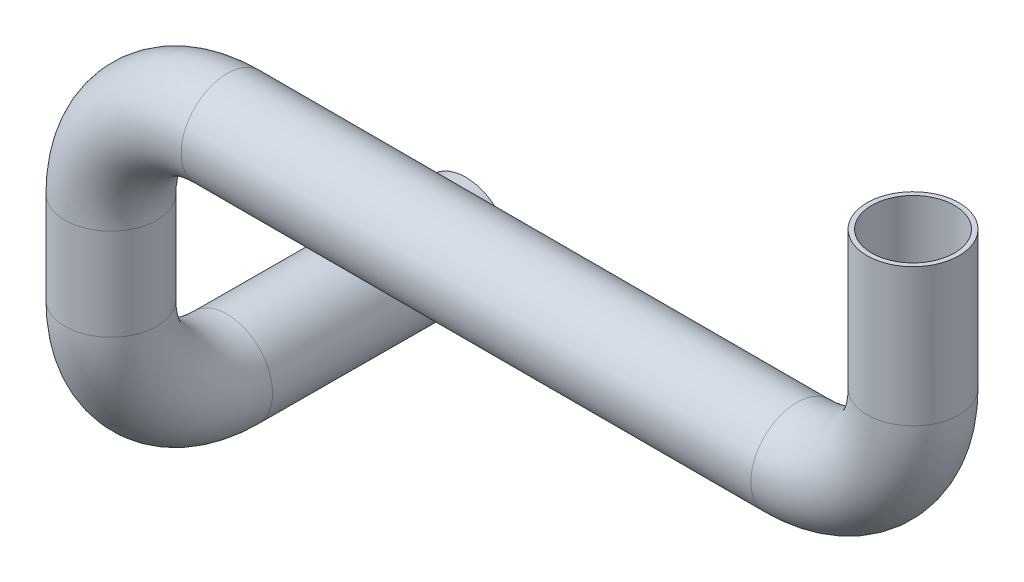
ISO-10303-21;
HEADER;
FILE_DESCRIPTION(('STEP AP214'),'2;1');
FILE_NAME('part.step','',(''),(''),'','','');
FILE_SCHEMA(('AUTOMOTIVE_DESIGN { 1 0 10303 214 1 1 1 1 }'));
ENDSEC;
DATA;
#1=APPLICATION_CONTEXT('core data for automotive mechanical design processes');
#2=APPLICATION_PROTOCOL_DEFINITION('international standard','automotive_design',2000,#1);
#3=PRODUCT_CONTEXT('',#1,'mechanical');
#4=PRODUCT('Part','Part','',(#3));
#5=PRODUCT_RELATED_PRODUCT_CATEGORY('part','',(#4));
#6=PRODUCT_DEFINITION_FORMATION('','',#4);
#7=PRODUCT_DEFINITION_CONTEXT('part definition',#1,'design');
#8=PRODUCT_DEFINITION('design','',#6,#7);
#9=PRODUCT_DEFINITION_SHAPE('','',#8);
#10=(LENGTH_UNIT() NAMED_UNIT(*) SI_UNIT(.MILLI.,.METRE.));
#11=(NAMED_UNIT(*) PLANE_ANGLE_UNIT() SI_UNIT($,.RADIAN.));
#12=(NAMED_UNIT(*) SI_UNIT($,.STERADIAN.) SOLID_ANGLE_UNIT());
#13=UNCERTAINTY_MEASURE_WITH_UNIT(LENGTH_MEASURE(1.E-05),#10,'distance_accuracy_value','');
#14=(GEOMETRIC_REPRESENTATION_CONTEXT(3) GLOBAL_UNCERTAINTY_ASSIGNED_CONTEXT((#13)) GLOBAL_UNIT_ASSIGNED_CONTEXT((#10,
#11,#12)) REPRESENTATION_CONTEXT('',''));
#15=CARTESIAN_POINT('',(0.,0.,0.));
#16=DIRECTION('',(0.,0.,1.));
#17=DIRECTION('',(1.,0.,0.));
#18=AXIS2_PLACEMENT_3D('',#15,#16,#17);
#19=CARTESIAN_POINT('',(87.3,50.3,0.));
#20=DIRECTION('',(0.,1.,0.));
#21=DIRECTION('',(0.,0.,1.));
#22=AXIS2_PLACEMENT_3D('',#19,#20,#21);
#23=PLANE('',#22);
#24=CARTESIAN_POINT('',(87.3,50.3,0.));
#25=DIRECTION('',(0.,1.,0.));
#26=DIRECTION('',(0.,0.,1.));
#27=AXIS2_PLACEMENT_3D('',#24,#25,#26);
#28=CIRCLE('',#27,4.5);
#29=CARTESIAN_POINT('',(87.3,50.3,4.5));
#30=VERTEX_POINT('',#29);
#31=EDGE_CURVE('E62',#30,#30,#28,.T.);
#32=ORIENTED_EDGE('',*,*,#31,.F.);
#33=EDGE_LOOP('',(#32));
#34=FACE_BOUND('',#33,.T.);
#35=CARTESIAN_POINT('',(87.3,50.3,0.));
#36=DIRECTION('',(0.,1.,0.));
#37=DIRECTION('',(0.,0.,1.));
#38=AXIS2_PLACEMENT_3D('',#35,#36,#37);
#39=CIRCLE('',#38,5.);
#40=CARTESIAN_POINT('',(87.3,50.3,5.));
#41=VERTEX_POINT('',#40);
#42=EDGE_CURVE('E10',#41,#41,#39,.T.);
#43=ORIENTED_EDGE('',*,*,#42,.T.);
#44=EDGE_LOOP('',(#43));
#45=FACE_BOUND('',#44,.T.);
#46=ADVANCED_FACE('F31',(#34,#45),#23,.T.);
#47=CARTESIAN_POINT('',(0.,0.,0.));
#48=DIRECTION('',(0.,1.,0.));
#49=DIRECTION('',(0.,0.,1.));
#50=AXIS2_PLACEMENT_3D('',#47,#48,#49);
#51=CYLINDRICAL_SURFACE('',#50,5.);
#52=CARTESIAN_POINT('',(0.,10.,0.));
#53=DIRECTION('',(0.,1.,0.));
#54=DIRECTION('',(0.,0.,1.));
#55=AXIS2_PLACEMENT_3D('',#52,#53,#54);
#56=CIRCLE('',#55,5.);
#57=CARTESIAN_POINT('',(-5.,10.,0.));
#58=VERTEX_POINT('',#57);
#59=EDGE_CURVE('E50',#58,#58,#56,.T.);
#60=ORIENTED_EDGE('',*,*,#59,.F.);
#61=EDGE_LOOP('',(#60));
#62=FACE_BOUND('',#61,.T.);
#63=CARTESIAN_POINT('',(0.,0.,0.));
#64=DIRECTION('',(0.,-1.,0.));
#65=DIRECTION('',(0.,0.,-1.));
#66=AXIS2_PLACEMENT_3D('',#63,#64,#65);
#67=CIRCLE('',#66,5.);
#68=CARTESIAN_POINT('',(0.,0.,5.));
#69=VERTEX_POINT('',#68);
#70=EDGE_CURVE('E59',#69,#69,#67,.T.);
#71=ORIENTED_EDGE('',*,*,#70,.F.);
#72=EDGE_LOOP('',(#71));
#73=FACE_BOUND('',#72,.T.);
#74=ADVANCED_FACE('F128',(#62,#73),#51,.T.);
#75=CARTESIAN_POINT('',(12.65,10.,0.));
#76=DIRECTION('',(0.,0.,-1.));
#77=DIRECTION('',(-1.,0.,0.));
#78=AXIS2_PLACEMENT_3D('',#75,#76,#77);
#79=TOROIDAL_SURFACE('',#78,12.65,5.);
#80=CARTESIAN_POINT('',(12.65,22.65,0.));
#81=DIRECTION('',(1.,0.,0.));
#82=DIRECTION('',(0.,0.,1.));
#83=AXIS2_PLACEMENT_3D('',#80,#81,#82);
#84=CIRCLE('',#83,5.);
#85=CARTESIAN_POINT('',(12.65,27.65,0.));
#86=VERTEX_POINT('',#85);
#87=EDGE_CURVE('E45',#86,#86,#84,.T.);
#88=CARTESIAN_POINT('',(12.65,10.,0.));
#89=DIRECTION('',(0.,0.,-1.));
#90=DIRECTION('',(-1.,0.,0.));
#91=AXIS2_PLACEMENT_3D('',#88,#89,#90);
#92=CIRCLE('',#91,17.65);
#93=EDGE_CURVE('',#58,#86,#92,.T.);
#94=ORIENTED_EDGE('',*,*,#59,.T.);
#95=ORIENTED_EDGE('',*,*,#87,.F.);
#96=ORIENTED_EDGE('',*,*,#93,.T.);
#97=ORIENTED_EDGE('',*,*,#93,.F.);
#98=EDGE_LOOP('',(#94,#96,#95,#97));
#99=FACE_BOUND('',#98,.T.);
#100=ADVANCED_FACE('F124',(#99),#79,.T.);
#101=CARTESIAN_POINT('',(12.65,22.65,0.));
#102=DIRECTION('',(1.,0.,0.));
#103=DIRECTION('',(0.,1.,0.));
#104=AXIS2_PLACEMENT_3D('',#101,#102,#103);
#105=CYLINDRICAL_SURFACE('',#104,5.);
#106=CARTESIAN_POINT('',(74.65,22.65,0.));
#107=DIRECTION('',(1.,0.,0.));
#108=DIRECTION('',(0.,0.,1.));
#109=AXIS2_PLACEMENT_3D('',#106,#107,#108);
#110=CIRCLE('',#109,5.);
#111=CARTESIAN_POINT('',(74.65,17.65,0.));
#112=VERTEX_POINT('',#111);
#113=EDGE_CURVE('E41',#112,#112,#110,.T.);
#114=ORIENTED_EDGE('',*,*,#113,.F.);
#115=EDGE_LOOP('',(#114));
#116=FACE_BOUND('',#115,.T.);
#117=ORIENTED_EDGE('',*,*,#87,.T.);
#118=EDGE_LOOP('',(#117));
#119=FACE_BOUND('',#118,.T.);
#120=ADVANCED_FACE('F118',(#116,#119),#105,.T.);
#121=CARTESIAN_POINT('',(74.65,35.3,0.));
#122=DIRECTION('',(0.,0.,1.));
#123=DIRECTION('',(1.,0.,0.));
#124=AXIS2_PLACEMENT_3D('',#121,#122,#123);
#125=TOROIDAL_SURFACE('',#124,12.65,5.);
#126=CARTESIAN_POINT('',(87.3,35.3,0.));
#127=DIRECTION('',(0.,1.,0.));
#128=DIRECTION('',(0.,0.,1.));
#129=AXIS2_PLACEMENT_3D('',#126,#127,#128);
#130=CIRCLE('',#129,5.);
#131=CARTESIAN_POINT('',(92.3,35.3,0.));
#132=VERTEX_POINT('',#131);
#133=EDGE_CURVE('E37',#132,#132,#130,.T.);
#134=CARTESIAN_POINT('',(74.65,35.3,0.));
#135=DIRECTION('',(0.,0.,1.));
#136=DIRECTION('',(1.,0.,0.));
#137=AXIS2_PLACEMENT_3D('',#134,#135,#136);
#138=CIRCLE('',#137,17.65);
#139=EDGE_CURVE('',#112,#132,#138,.T.);
#140=ORIENTED_EDGE('',*,*,#113,.T.);
#141=ORIENTED_EDGE('',*,*,#133,.F.);
#142=ORIENTED_EDGE('',*,*,#139,.T.);
#143=ORIENTED_EDGE('',*,*,#139,.F.);
#144=EDGE_LOOP('',(#140,#142,#141,#143));
#145=FACE_BOUND('',#144,.T.);
#146=ADVANCED_FACE('F108',(#145),#125,.T.);
#147=CARTESIAN_POINT('',(87.3,35.3,0.));
#148=DIRECTION('',(0.,1.,0.));
#149=DIRECTION('',(0.,0.,1.));
#150=AXIS2_PLACEMENT_3D('',#147,#148,#149);
#151=CYLINDRICAL_SURFACE('',#150,5.);
#152=ORIENTED_EDGE('',*,*,#42,.F.);
#153=EDGE_LOOP('',(#152));
#154=FACE_BOUND('',#153,.T.);
#155=ORIENTED_EDGE('',*,*,#133,.T.);
#156=EDGE_LOOP('',(#155));
#157=FACE_BOUND('',#156,.T.);
#158=ADVANCED_FACE('F105',(#154,#157),#151,.T.);
#159=CARTESIAN_POINT('',(0.,-12.757100001659,-38.5978398523668));
#160=DIRECTION('',(0.,-0.0041233318287153,-0.999991499031182));
#161=DIRECTION('',(0.,0.999991499031182,-0.0041233318287153));
#162=AXIS2_PLACEMENT_3D('',#159,#160,#161);
#163=PLANE('',#162);
#164=CARTESIAN_POINT('',(0.,-12.757100001659,-38.5978398523668));
#165=DIRECTION('',(0.,-0.0041233318287153,-0.999991499031182));
#166=DIRECTION('',(0.,0.999991499031182,-0.0041233318287153));
#167=AXIS2_PLACEMENT_3D('',#164,#165,#166);
#168=CIRCLE('',#167,4.5);
#169=CARTESIAN_POINT('',(0.,-8.25713825601868,-38.616394845596));
#170=VERTEX_POINT('',#169);
#171=EDGE_CURVE('E63',#170,#170,#168,.T.);
#172=ORIENTED_EDGE('',*,*,#171,.F.);
#173=EDGE_LOOP('',(#172));
#174=FACE_BOUND('',#173,.T.);
#175=CARTESIAN_POINT('',(0.,-12.757100001659,-38.5978398523668));
#176=DIRECTION('',(0.,-0.0041233318287153,-0.999991499031182));
#177=DIRECTION('',(0.,0.999991499031182,-0.0041233318287153));
#178=AXIS2_PLACEMENT_3D('',#175,#176,#177);
#179=CIRCLE('',#178,5.);
#180=CARTESIAN_POINT('',(0.,-7.75714250650309,-38.6184565115103));
#181=VERTEX_POINT('',#180);
#182=EDGE_CURVE('E53',#181,#181,#179,.T.);
#183=ORIENTED_EDGE('',*,*,#182,.T.);
#184=EDGE_LOOP('',(#183));
#185=FACE_BOUND('',#184,.T.);
#186=ADVANCED_FACE('F107',(#174,#185),#163,.T.);
#187=CARTESIAN_POINT('',(0.,0.,-12.65));
#188=DIRECTION('',(1.,0.,0.));
#189=DIRECTION('',(0.,0.,-1.));
#190=AXIS2_PLACEMENT_3D('',#187,#188,#189);
#191=TOROIDAL_SURFACE('',#190,12.65,5.);
#192=CARTESIAN_POINT('',(0.,-12.6498924627445,-12.5978398523667));
#193=DIRECTION('',(0.,-0.00412333182871599,-0.999991499031182));
#194=DIRECTION('',(0.,0.999991499031182,-0.00412333182871599));
#195=AXIS2_PLACEMENT_3D('',#192,#193,#194);
#196=CIRCLE('',#195,5.);
#197=CARTESIAN_POINT('',(0.,-17.6498499579004,-12.5772231932232));
#198=VERTEX_POINT('',#197);
#199=EDGE_CURVE('E56',#198,#198,#196,.T.);
#200=CARTESIAN_POINT('',(0.,0.,-12.65));
#201=DIRECTION('',(1.,0.,0.));
#202=DIRECTION('',(0.,0.,-1.));
#203=AXIS2_PLACEMENT_3D('',#200,#201,#202);
#204=CIRCLE('',#203,17.65);
#205=EDGE_CURVE('',#69,#198,#204,.T.);
#206=ORIENTED_EDGE('',*,*,#70,.T.);
#207=ORIENTED_EDGE('',*,*,#199,.F.);
#208=ORIENTED_EDGE('',*,*,#205,.T.);
#209=ORIENTED_EDGE('',*,*,#205,.F.);
#210=EDGE_LOOP('',(#206,#208,#207,#209));
#211=FACE_BOUND('',#210,.T.);
#212=ADVANCED_FACE('F114',(#211),#191,.T.);
#213=CARTESIAN_POINT('',(0.,-12.6498924627445,-12.5978398523667));
#214=DIRECTION('',(0.,-0.00412333182871543,-0.999991499031182));
#215=DIRECTION('',(0.,0.999991499031182,-0.00412333182871543));
#216=AXIS2_PLACEMENT_3D('',#213,#214,#215);
#217=CYLINDRICAL_SURFACE('',#216,5.);
#218=ORIENTED_EDGE('',*,*,#182,.F.);
#219=EDGE_LOOP('',(#218));
#220=FACE_BOUND('',#219,.T.);
#221=ORIENTED_EDGE('',*,*,#199,.T.);
#222=EDGE_LOOP('',(#221));
#223=FACE_BOUND('',#222,.T.);
#224=ADVANCED_FACE('F102',(#220,#223),#217,.T.);
#225=CARTESIAN_POINT('',(0.,0.,0.));
#226=DIRECTION('',(0.,1.,0.));
#227=DIRECTION('',(0.,0.,1.));
#228=AXIS2_PLACEMENT_3D('',#225,#226,#227);
#229=CYLINDRICAL_SURFACE('',#228,4.5);
#230=CARTESIAN_POINT('',(0.,10.,0.));
#231=DIRECTION('',(0.,-1.,0.));
#232=DIRECTION('',(0.,0.,-1.));
#233=AXIS2_PLACEMENT_3D('',#230,#231,#232);
#234=CIRCLE('',#233,4.5);
#235=CARTESIAN_POINT('',(-4.5,10.,0.));
#236=VERTEX_POINT('',#235);
#237=EDGE_CURVE('E66',#236,#236,#234,.F.);
#238=ORIENTED_EDGE('',*,*,#237,.T.);
#239=EDGE_LOOP('',(#238));
#240=FACE_BOUND('',#239,.T.);
#241=CARTESIAN_POINT('',(0.,0.,0.));
#242=DIRECTION('',(0.,1.,0.));
#243=DIRECTION('',(0.,0.,1.));
#244=AXIS2_PLACEMENT_3D('',#241,#242,#243);
#245=CIRCLE('',#244,4.5);
#246=CARTESIAN_POINT('',(0.,0.,4.5));
#247=VERTEX_POINT('',#246);
#248=EDGE_CURVE('E73',#247,#247,#245,.F.);
#249=ORIENTED_EDGE('',*,*,#248,.T.);
#250=EDGE_LOOP('',(#249));
#251=FACE_BOUND('',#250,.T.);
#252=ADVANCED_FACE('F87',(#240,#251),#229,.F.);
#253=CARTESIAN_POINT('',(12.65,10.,0.));
#254=DIRECTION('',(0.,0.,-1.));
#255=DIRECTION('',(-1.,0.,0.));
#256=AXIS2_PLACEMENT_3D('',#253,#254,#255);
#257=TOROIDAL_SURFACE('',#256,12.65,4.5);
#258=CARTESIAN_POINT('',(12.65,22.65,0.));
#259=DIRECTION('',(1.,0.,0.));
#260=DIRECTION('',(0.,1.,0.));
#261=AXIS2_PLACEMENT_3D('',#258,#259,#260);
#262=CIRCLE('',#261,4.5);
#263=CARTESIAN_POINT('',(12.65,27.15,0.));
#264=VERTEX_POINT('',#263);
#265=EDGE_CURVE('E79',#264,#264,#262,.T.);
#266=CARTESIAN_POINT('',(12.65,10.,0.));
#267=DIRECTION('',(0.,0.,-1.));
#268=DIRECTION('',(-1.,0.,0.));
#269=AXIS2_PLACEMENT_3D('',#266,#267,#268);
#270=CIRCLE('',#269,17.15);
#271=EDGE_CURVE('',#236,#264,#270,.T.);
#272=ORIENTED_EDGE('',*,*,#237,.F.);
#273=ORIENTED_EDGE('',*,*,#265,.T.);
#274=ORIENTED_EDGE('',*,*,#271,.T.);
#275=ORIENTED_EDGE('',*,*,#271,.F.);
#276=EDGE_LOOP('',(#272,#274,#273,#275));
#277=FACE_BOUND('',#276,.T.);
#278=ADVANCED_FACE('F90',(#277),#257,.F.);
#279=CARTESIAN_POINT('',(12.65,22.65,0.));
#280=DIRECTION('',(1.,0.,0.));
#281=DIRECTION('',(0.,1.,0.));
#282=AXIS2_PLACEMENT_3D('',#279,#280,#281);
#283=CYLINDRICAL_SURFACE('',#282,4.5);
#284=CARTESIAN_POINT('',(74.65,22.65,0.));
#285=DIRECTION('',(-1.,0.,0.));
#286=DIRECTION('',(0.,-1.,0.));
#287=AXIS2_PLACEMENT_3D('',#284,#285,#286);
#288=CIRCLE('',#287,4.5);
#289=CARTESIAN_POINT('',(74.65,18.15,0.));
#290=VERTEX_POINT('',#289);
#291=EDGE_CURVE('E76',#290,#290,#288,.F.);
#292=ORIENTED_EDGE('',*,*,#291,.T.);
#293=EDGE_LOOP('',(#292));
#294=FACE_BOUND('',#293,.T.);
#295=ORIENTED_EDGE('',*,*,#265,.F.);
#296=EDGE_LOOP('',(#295));
#297=FACE_BOUND('',#296,.T.);
#298=ADVANCED_FACE('F92',(#294,#297),#283,.F.);
#299=CARTESIAN_POINT('',(74.65,35.3,0.));
#300=DIRECTION('',(0.,0.,1.));
#301=DIRECTION('',(1.,0.,0.));
#302=AXIS2_PLACEMENT_3D('',#299,#300,#301);
#303=TOROIDAL_SURFACE('',#302,12.65,4.5);
#304=CARTESIAN_POINT('',(87.3,35.3,0.));
#305=DIRECTION('',(0.,1.,0.));
#306=DIRECTION('',(0.,0.,1.));
#307=AXIS2_PLACEMENT_3D('',#304,#305,#306);
#308=CIRCLE('',#307,4.5);
#309=CARTESIAN_POINT('',(91.8,35.3,0.));
#310=VERTEX_POINT('',#309);
#311=EDGE_CURVE('E70',#310,#310,#308,.T.);
#312=CARTESIAN_POINT('',(74.65,35.3,0.));
#313=DIRECTION('',(0.,0.,1.));
#314=DIRECTION('',(1.,0.,0.));
#315=AXIS2_PLACEMENT_3D('',#312,#313,#314);
#316=CIRCLE('',#315,17.15);
#317=EDGE_CURVE('',#290,#310,#316,.T.);
#318=ORIENTED_EDGE('',*,*,#291,.F.);
#319=ORIENTED_EDGE('',*,*,#311,.T.);
#320=ORIENTED_EDGE('',*,*,#317,.T.);
#321=ORIENTED_EDGE('',*,*,#317,.F.);
#322=EDGE_LOOP('',(#318,#320,#319,#321));
#323=FACE_BOUND('',#322,.T.);
#324=ADVANCED_FACE('F99',(#323),#303,.F.);
#325=CARTESIAN_POINT('',(87.3,35.3,0.));
#326=DIRECTION('',(0.,1.,0.));
#327=DIRECTION('',(0.,0.,1.));
#328=AXIS2_PLACEMENT_3D('',#325,#326,#327);
#329=CYLINDRICAL_SURFACE('',#328,4.5);
#330=ORIENTED_EDGE('',*,*,#31,.T.);
#331=EDGE_LOOP('',(#330));
#332=FACE_BOUND('',#331,.T.);
#333=ORIENTED_EDGE('',*,*,#311,.F.);
#334=EDGE_LOOP('',(#333));
#335=FACE_BOUND('',#334,.T.);
#336=ADVANCED_FACE('F117',(#332,#335),#329,.F.);
#337=CARTESIAN_POINT('',(0.,0.,-12.65));
#338=DIRECTION('',(1.,0.,0.));
#339=DIRECTION('',(0.,0.,-1.));
#340=AXIS2_PLACEMENT_3D('',#337,#338,#339);
#341=TOROIDAL_SURFACE('',#340,12.65,4.5);
#342=CARTESIAN_POINT('',(0.,-12.6498924627445,-12.5978398523667));
#343=DIRECTION('',(0.,-0.00412333182871543,-0.999991499031182));
#344=DIRECTION('',(0.,0.999991499031182,-0.00412333182871543));
#345=AXIS2_PLACEMENT_3D('',#342,#343,#344);
#346=CIRCLE('',#345,4.5);
#347=CARTESIAN_POINT('',(0.,-17.1498542083848,-12.5792848591375));
#348=VERTEX_POINT('',#347);
#349=EDGE_CURVE('E67',#348,#348,#346,.T.);
#350=CARTESIAN_POINT('',(0.,0.,-12.65));
#351=DIRECTION('',(1.,0.,0.));
#352=DIRECTION('',(0.,0.,-1.));
#353=AXIS2_PLACEMENT_3D('',#350,#351,#352);
#354=CIRCLE('',#353,17.15);
#355=EDGE_CURVE('',#247,#348,#354,.T.);
#356=ORIENTED_EDGE('',*,*,#248,.F.);
#357=ORIENTED_EDGE('',*,*,#349,.T.);
#358=ORIENTED_EDGE('',*,*,#355,.T.);
#359=ORIENTED_EDGE('',*,*,#355,.F.);
#360=EDGE_LOOP('',(#356,#358,#357,#359));
#361=FACE_BOUND('',#360,.T.);
#362=ADVANCED_FACE('F141',(#361),#341,.F.);
#363=CARTESIAN_POINT('',(0.,-12.6498924627445,-12.5978398523667));
#364=DIRECTION('',(0.,-0.00412333182871543,-0.999991499031182));
#365=DIRECTION('',(0.,0.999991499031182,-0.00412333182871543));
#366=AXIS2_PLACEMENT_3D('',#363,#364,#365);
#367=CYLINDRICAL_SURFACE('',#366,4.5);
#368=ORIENTED_EDGE('',*,*,#171,.T.);
#369=EDGE_LOOP('',(#368));
#370=FACE_BOUND('',#369,.T.);
#371=ORIENTED_EDGE('',*,*,#349,.F.);
#372=EDGE_LOOP('',(#371));
#373=FACE_BOUND('',#372,.T.);
#374=ADVANCED_FACE('F104',(#370,#373),#367,.F.);
#375=CLOSED_SHELL('',(#46,#74,#100,#120,#146,#158,#186,#212,#224,#252,#278,#298,#324,#336,#362,#374));
#376=MANIFOLD_SOLID_BREP('B2',#375);
#377=ADVANCED_BREP_SHAPE_REPRESENTATION('',(#18,#376),#14);
#378=SHAPE_DEFINITION_REPRESENTATION(#9,#377);
ENDSEC;
END-ISO-10303-21;
